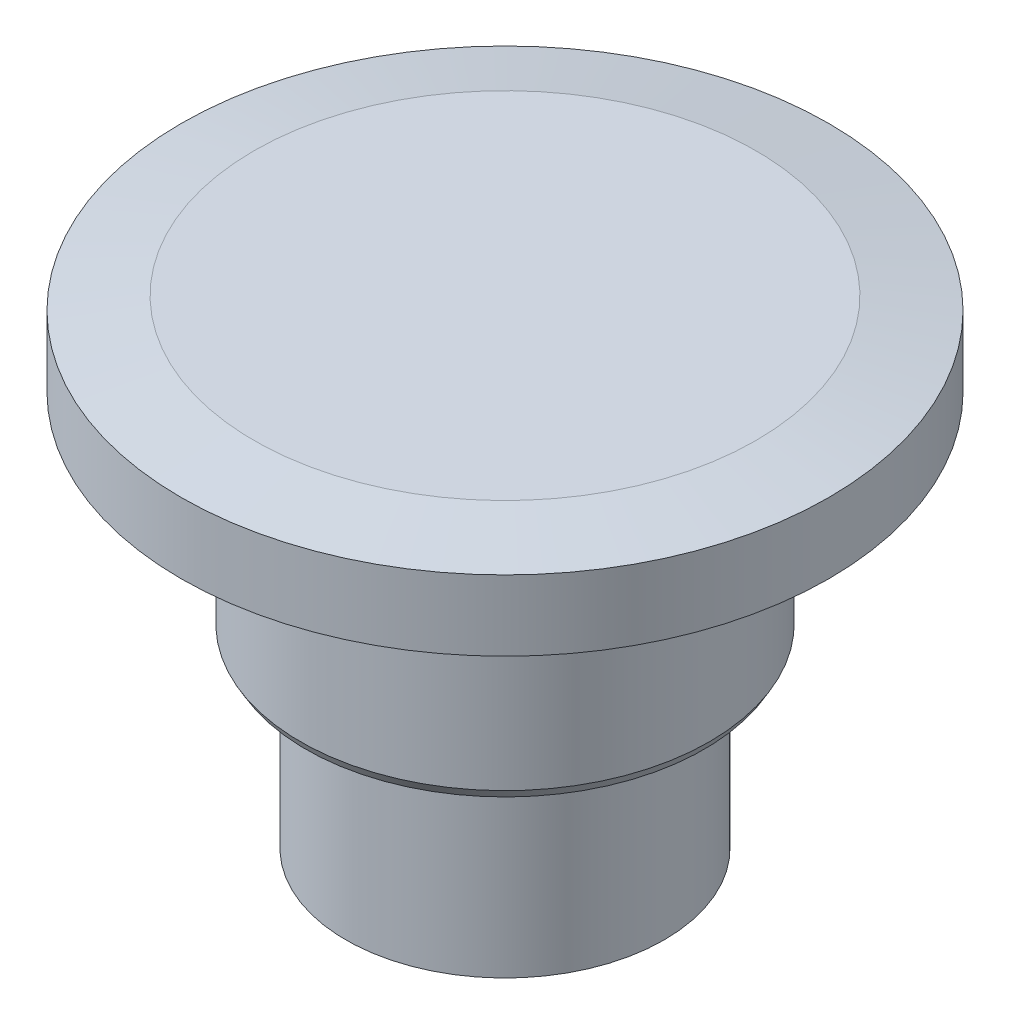
ISO-10303-21;
HEADER;
FILE_DESCRIPTION(('STEP AP214'),'2;1');
FILE_NAME('part.step','',(''),(''),'','','');
FILE_SCHEMA(('AUTOMOTIVE_DESIGN { 1 0 10303 214 1 1 1 1 }'));
ENDSEC;
DATA;
#1=APPLICATION_CONTEXT('core data for automotive mechanical design processes');
#2=APPLICATION_PROTOCOL_DEFINITION('international standard','automotive_design',2000,#1);
#3=PRODUCT_CONTEXT('',#1,'mechanical');
#4=PRODUCT('Part','Part','',(#3));
#5=PRODUCT_RELATED_PRODUCT_CATEGORY('part','',(#4));
#6=PRODUCT_DEFINITION_FORMATION('','',#4);
#7=PRODUCT_DEFINITION_CONTEXT('part definition',#1,'design');
#8=PRODUCT_DEFINITION('design','',#6,#7);
#9=PRODUCT_DEFINITION_SHAPE('','',#8);
#10=(LENGTH_UNIT() NAMED_UNIT(*) SI_UNIT(.MILLI.,.METRE.));
#11=(NAMED_UNIT(*) PLANE_ANGLE_UNIT() SI_UNIT($,.RADIAN.));
#12=(NAMED_UNIT(*) SI_UNIT($,.STERADIAN.) SOLID_ANGLE_UNIT());
#13=UNCERTAINTY_MEASURE_WITH_UNIT(LENGTH_MEASURE(1.E-05),#10,'distance_accuracy_value','');
#14=(GEOMETRIC_REPRESENTATION_CONTEXT(3) GLOBAL_UNCERTAINTY_ASSIGNED_CONTEXT((#13)) GLOBAL_UNIT_ASSIGNED_CONTEXT((#10,
#11,#12)) REPRESENTATION_CONTEXT('',''));
#15=CARTESIAN_POINT('',(0.,0.,0.));
#16=DIRECTION('',(0.,0.,1.));
#17=DIRECTION('',(1.,0.,0.));
#18=AXIS2_PLACEMENT_3D('',#15,#16,#17);
#19=CARTESIAN_POINT('',(0.,-20.35,0.));
#20=DIRECTION('',(0.,-1.,0.));
#21=DIRECTION('',(1.,0.,0.));
#22=AXIS2_PLACEMENT_3D('',#19,#20,#21);
#23=PLANE('',#22);
#24=CARTESIAN_POINT('',(0.,-20.35,0.));
#25=DIRECTION('',(0.,-1.,0.));
#26=DIRECTION('',(1.,0.,0.));
#27=AXIS2_PLACEMENT_3D('',#24,#25,#26);
#28=CIRCLE('',#27,8.6);
#29=CARTESIAN_POINT('',(8.6,-20.35,0.));
#30=VERTEX_POINT('',#29);
#31=EDGE_CURVE('E244',#30,#30,#28,.T.);
#32=ORIENTED_EDGE('',*,*,#31,.T.);
#33=EDGE_LOOP('',(#32));
#34=FACE_BOUND('',#33,.T.);
#35=DIRECTION('',(-0.707106781186547,0.,-0.707106781186548));
#36=VECTOR('',#35,1.);
#37=CARTESIAN_POINT('',(-4.05,-20.35,4.05));
#38=LINE('',#37,#36);
#39=CARTESIAN_POINT('',(-6.36894372506106,-20.35,1.73105627493894));
#40=VERTEX_POINT('',#39);
#41=CARTESIAN_POINT('',(-7.,-20.35,1.1));
#42=VERTEX_POINT('',#41);
#43=EDGE_CURVE('E149',#40,#42,#38,.T.);
#44=ORIENTED_EDGE('',*,*,#43,.F.);
#45=CARTESIAN_POINT('',(0.,-20.35,0.));
#46=DIRECTION('',(0.,-1.,0.));
#47=DIRECTION('',(1.,0.,0.));
#48=AXIS2_PLACEMENT_3D('',#45,#46,#47);
#49=CIRCLE('',#48,6.60000000000001);
#50=CARTESIAN_POINT('',(-6.36894372506106,-20.35,-1.73105627493894));
#51=VERTEX_POINT('',#50);
#52=EDGE_CURVE('E76',#40,#51,#49,.F.);
#53=ORIENTED_EDGE('',*,*,#52,.T.);
#54=DIRECTION('',(-0.707106781186548,0.,0.707106781186547));
#55=VECTOR('',#54,1.);
#56=CARTESIAN_POINT('',(-4.05,-20.35,-4.05));
#57=LINE('',#56,#55);
#58=CARTESIAN_POINT('',(-7.,-20.35,-1.1));
#59=VERTEX_POINT('',#58);
#60=EDGE_CURVE('E158',#51,#59,#57,.T.);
#61=ORIENTED_EDGE('',*,*,#60,.T.);
#62=DIRECTION('',(0.,0.,1.));
#63=VECTOR('',#62,1.);
#64=CARTESIAN_POINT('',(-7.,-20.35,0.));
#65=LINE('',#64,#63);
#66=EDGE_CURVE('E164',#59,#42,#65,.T.);
#67=ORIENTED_EDGE('',*,*,#66,.T.);
#68=EDGE_LOOP('',(#44,#53,#61,#67));
#69=FACE_BOUND('',#68,.T.);
#70=ADVANCED_FACE('F51',(#34,#69),#23,.T.);
#71=CARTESIAN_POINT('',(0.,-16.35,0.));
#72=DIRECTION('',(0.,1.,0.));
#73=DIRECTION('',(-1.,0.,0.));
#74=AXIS2_PLACEMENT_3D('',#71,#72,#73);
#75=PLANE('',#74);
#76=DIRECTION('',(1.,0.,0.));
#77=VECTOR('',#76,1.);
#78=CARTESIAN_POINT('',(0.,-16.35,-1.85));
#79=LINE('',#78,#77);
#80=CARTESIAN_POINT('',(-2.36167313572391,-16.35,-1.85));
#81=VERTEX_POINT('',#80);
#82=CARTESIAN_POINT('',(-0.75,-16.35,-1.85));
#83=VERTEX_POINT('',#82);
#84=EDGE_CURVE('E241',#81,#83,#79,.T.);
#85=ORIENTED_EDGE('',*,*,#84,.F.);
#86=CARTESIAN_POINT('',(0.,-16.35,0.));
#87=DIRECTION('',(0.,-1.,0.));
#88=DIRECTION('',(1.,0.,0.));
#89=AXIS2_PLACEMENT_3D('',#86,#87,#88);
#90=CIRCLE('',#89,3.);
#91=CARTESIAN_POINT('',(-2.36167313572391,-16.35,1.85));
#92=VERTEX_POINT('',#91);
#93=EDGE_CURVE('E270',#81,#92,#90,.T.);
#94=ORIENTED_EDGE('',*,*,#93,.T.);
#95=DIRECTION('',(1.,0.,0.));
#96=VECTOR('',#95,1.);
#97=CARTESIAN_POINT('',(0.,-16.35,1.85));
#98=LINE('',#97,#96);
#99=CARTESIAN_POINT('',(-0.75,-16.35,1.85));
#100=VERTEX_POINT('',#99);
#101=EDGE_CURVE('E234',#92,#100,#98,.T.);
#102=ORIENTED_EDGE('',*,*,#101,.T.);
#103=DIRECTION('',(0.707106781186548,0.,-0.707106781186547));
#104=VECTOR('',#103,1.);
#105=CARTESIAN_POINT('',(0.550000000000001,-16.35,0.550000000000001));
#106=LINE('',#105,#104);
#107=CARTESIAN_POINT('',(0.,-16.35,1.1));
#108=VERTEX_POINT('',#107);
#109=EDGE_CURVE('E294',#100,#108,#106,.T.);
#110=ORIENTED_EDGE('',*,*,#109,.T.);
#111=DIRECTION('',(0.,0.,-1.));
#112=VECTOR('',#111,1.);
#113=CARTESIAN_POINT('',(0.,-16.35,0.));
#114=LINE('',#113,#112);
#115=CARTESIAN_POINT('',(0.,-16.35,-1.1));
#116=VERTEX_POINT('',#115);
#117=EDGE_CURVE('E298',#108,#116,#114,.T.);
#118=ORIENTED_EDGE('',*,*,#117,.T.);
#119=DIRECTION('',(0.707106781186548,0.,0.707106781186548));
#120=VECTOR('',#119,1.);
#121=CARTESIAN_POINT('',(0.549999999999999,-16.35,-0.549999999999999));
#122=LINE('',#121,#120);
#123=EDGE_CURVE('E302',#83,#116,#122,.T.);
#124=ORIENTED_EDGE('',*,*,#123,.F.);
#125=EDGE_LOOP('',(#85,#94,#102,#110,#118,#124));
#126=FACE_BOUND('',#125,.T.);
#127=ADVANCED_FACE('F348',(#126),#75,.F.);
#128=CARTESIAN_POINT('',(0.,-16.35,0.));
#129=DIRECTION('',(0.,-1.,0.));
#130=DIRECTION('',(1.,0.,0.));
#131=AXIS2_PLACEMENT_3D('',#128,#129,#130);
#132=CYLINDRICAL_SURFACE('',#131,3.);
#133=DIRECTION('',(0.,-1.,0.));
#134=VECTOR('',#133,1.);
#135=CARTESIAN_POINT('',(-2.36167313572391,-16.35,-1.85));
#136=LINE('',#135,#134);
#137=CARTESIAN_POINT('',(-2.36167313572391,-10.1,-1.85));
#138=VERTEX_POINT('',#137);
#139=EDGE_CURVE('E238',#138,#81,#136,.T.);
#140=ORIENTED_EDGE('',*,*,#139,.F.);
#141=CARTESIAN_POINT('',(0.,-10.1,0.));
#142=DIRECTION('',(0.,-1.,0.));
#143=DIRECTION('',(1.,0.,0.));
#144=AXIS2_PLACEMENT_3D('',#141,#142,#143);
#145=CIRCLE('',#144,3.);
#146=CARTESIAN_POINT('',(-2.36167313572391,-10.1,1.85));
#147=VERTEX_POINT('',#146);
#148=EDGE_CURVE('E274',#138,#147,#145,.T.);
#149=ORIENTED_EDGE('',*,*,#148,.T.);
#150=DIRECTION('',(0.,-1.,0.));
#151=VECTOR('',#150,1.);
#152=CARTESIAN_POINT('',(-2.36167313572391,-16.35,1.85));
#153=LINE('',#152,#151);
#154=EDGE_CURVE('E230',#147,#92,#153,.T.);
#155=ORIENTED_EDGE('',*,*,#154,.T.);
#156=ORIENTED_EDGE('',*,*,#93,.F.);
#157=EDGE_LOOP('',(#140,#149,#155,#156));
#158=FACE_BOUND('',#157,.T.);
#159=ADVANCED_FACE('F383',(#158),#132,.T.);
#160=CARTESIAN_POINT('',(0.,-16.35,0.));
#161=DIRECTION('',(0.,-1.,0.));
#162=DIRECTION('',(1.,0.,0.));
#163=AXIS2_PLACEMENT_3D('',#160,#161,#162);
#164=CYLINDRICAL_SURFACE('',#163,5.6);
#165=DIRECTION('',(0.,-1.,0.));
#166=VECTOR('',#165,1.);
#167=CARTESIAN_POINT('',(-5.28559362796649,-16.35,-1.85));
#168=LINE('',#167,#166);
#169=CARTESIAN_POINT('',(-5.28559362796649,-19.35,-1.85));
#170=VERTEX_POINT('',#169);
#171=CARTESIAN_POINT('',(-5.28559362796649,-10.1,-1.85));
#172=VERTEX_POINT('',#171);
#173=EDGE_CURVE('E291',#170,#172,#168,.F.);
#174=ORIENTED_EDGE('',*,*,#173,.F.);
#175=CARTESIAN_POINT('',(0.,-19.35,0.));
#176=DIRECTION('',(0.,-1.,0.));
#177=DIRECTION('',(1.,0.,0.));
#178=AXIS2_PLACEMENT_3D('',#175,#176,#177);
#179=CIRCLE('',#178,5.6);
#180=CARTESIAN_POINT('',(-5.28559362796649,-19.35,1.85));
#181=VERTEX_POINT('',#180);
#182=EDGE_CURVE('E305',#170,#181,#179,.T.);
#183=ORIENTED_EDGE('',*,*,#182,.T.);
#184=DIRECTION('',(0.,-1.,0.));
#185=VECTOR('',#184,1.);
#186=CARTESIAN_POINT('',(-5.28559362796649,-16.35,1.85));
#187=LINE('',#186,#185);
#188=CARTESIAN_POINT('',(-5.28559362796649,-10.1,1.85));
#189=VERTEX_POINT('',#188);
#190=EDGE_CURVE('E253',#181,#189,#187,.F.);
#191=ORIENTED_EDGE('',*,*,#190,.T.);
#192=CARTESIAN_POINT('',(0.,-10.1,0.));
#193=DIRECTION('',(0.,-1.,0.));
#194=DIRECTION('',(1.,0.,0.));
#195=AXIS2_PLACEMENT_3D('',#192,#193,#194);
#196=CIRCLE('',#195,5.6);
#197=EDGE_CURVE('E278',#172,#189,#196,.T.);
#198=ORIENTED_EDGE('',*,*,#197,.F.);
#199=EDGE_LOOP('',(#174,#183,#191,#198));
#200=FACE_BOUND('',#199,.T.);
#201=ADVANCED_FACE('F387',(#200),#164,.F.);
#202=CARTESIAN_POINT('',(0.,-10.35,0.));
#203=DIRECTION('',(0.,1.,0.));
#204=DIRECTION('',(-1.,0.,0.));
#205=AXIS2_PLACEMENT_3D('',#202,#203,#204);
#206=PLANE('',#205);
#207=CARTESIAN_POINT('',(0.,-10.35,0.));
#208=DIRECTION('',(0.,1.,0.));
#209=DIRECTION('',(-1.,0.,0.));
#210=AXIS2_PLACEMENT_3D('',#207,#208,#209);
#211=CIRCLE('',#210,10.7613248654052);
#212=CARTESIAN_POINT('',(-10.7613248654052,-10.35,0.));
#213=VERTEX_POINT('',#212);
#214=EDGE_CURVE('E61',#213,#213,#211,.F.);
#215=ORIENTED_EDGE('',*,*,#214,.T.);
#216=EDGE_LOOP('',(#215));
#217=FACE_BOUND('',#216,.T.);
#218=CARTESIAN_POINT('',(0.,-10.35,0.));
#219=DIRECTION('',(0.,-1.,0.));
#220=DIRECTION('',(1.,0.,0.));
#221=AXIS2_PLACEMENT_3D('',#218,#219,#220);
#222=CIRCLE('',#221,8.6);
#223=CARTESIAN_POINT('',(8.6,-10.35,0.));
#224=VERTEX_POINT('',#223);
#225=EDGE_CURVE('E249',#224,#224,#222,.T.);
#226=ORIENTED_EDGE('',*,*,#225,.F.);
#227=EDGE_LOOP('',(#226));
#228=FACE_BOUND('',#227,.T.);
#229=ADVANCED_FACE('F379',(#217,#228),#206,.F.);
#230=CARTESIAN_POINT('',(0.,5.5,0.));
#231=DIRECTION('',(0.,-1.,0.));
#232=DIRECTION('',(1.,0.,0.));
#233=AXIS2_PLACEMENT_3D('',#230,#231,#232);
#234=PLANE('',#233);
#235=CARTESIAN_POINT('',(0.,5.5,0.));
#236=DIRECTION('',(0.,-1.,0.));
#237=DIRECTION('',(1.,0.,0.));
#238=AXIS2_PLACEMENT_3D('',#235,#236,#237);
#239=CIRCLE('',#238,13.5607689879512);
#240=CARTESIAN_POINT('',(13.5607689879512,5.5,0.));
#241=VERTEX_POINT('',#240);
#242=EDGE_CURVE('E266',#241,#241,#239,.T.);
#243=ORIENTED_EDGE('',*,*,#242,.F.);
#244=EDGE_LOOP('',(#243));
#245=FACE_BOUND('',#244,.T.);
#246=ADVANCED_FACE('F375',(#245),#234,.F.);
#247=CARTESIAN_POINT('',(0.,4.8054072893323,0.));
#248=DIRECTION('',(0.,-1.,0.));
#249=DIRECTION('',(1.,0.,0.));
#250=AXIS2_PLACEMENT_3D('',#247,#248,#249);
#251=CONICAL_SURFACE('',#250,17.5,1.39626340159547);
#252=ORIENTED_EDGE('',*,*,#242,.T.);
#253=EDGE_LOOP('',(#252));
#254=FACE_BOUND('',#253,.T.);
#255=CARTESIAN_POINT('',(0.,4.8054072893323,0.));
#256=DIRECTION('',(0.,-1.,0.));
#257=DIRECTION('',(1.,0.,0.));
#258=AXIS2_PLACEMENT_3D('',#255,#256,#257);
#259=CIRCLE('',#258,17.5);
#260=CARTESIAN_POINT('',(17.5,4.8054072893323,0.));
#261=VERTEX_POINT('',#260);
#262=EDGE_CURVE('E262',#261,#261,#259,.T.);
#263=ORIENTED_EDGE('',*,*,#262,.F.);
#264=EDGE_LOOP('',(#263));
#265=FACE_BOUND('',#264,.T.);
#266=ADVANCED_FACE('F371',(#254,#265),#251,.T.);
#267=CARTESIAN_POINT('',(0.,-16.35,0.));
#268=DIRECTION('',(0.,-1.,0.));
#269=DIRECTION('',(1.,0.,0.));
#270=AXIS2_PLACEMENT_3D('',#267,#268,#269);
#271=CYLINDRICAL_SURFACE('',#270,17.5);
#272=CARTESIAN_POINT('',(0.,1.00000000000006,0.));
#273=DIRECTION('',(0.,-1.,0.));
#274=DIRECTION('',(1.,0.,0.));
#275=AXIS2_PLACEMENT_3D('',#272,#273,#274);
#276=CIRCLE('',#275,17.5);
#277=CARTESIAN_POINT('',(17.5,1.00000000000006,0.));
#278=VERTEX_POINT('',#277);
#279=EDGE_CURVE('E282',#278,#278,#276,.F.);
#280=ORIENTED_EDGE('',*,*,#279,.T.);
#281=EDGE_LOOP('',(#280));
#282=FACE_BOUND('',#281,.T.);
#283=ORIENTED_EDGE('',*,*,#262,.T.);
#284=EDGE_LOOP('',(#283));
#285=FACE_BOUND('',#284,.T.);
#286=ADVANCED_FACE('F367',(#282,#285),#271,.T.);
#287=CARTESIAN_POINT('',(0.,-16.35,0.));
#288=DIRECTION('',(0.,-1.,0.));
#289=DIRECTION('',(1.,0.,0.));
#290=AXIS2_PLACEMENT_3D('',#287,#288,#289);
#291=CYLINDRICAL_SURFACE('',#290,12.05);
#292=CARTESIAN_POINT('',(0.,0.330824143079245,0.));
#293=DIRECTION('',(0.,1.,0.));
#294=DIRECTION('',(-1.,0.,0.));
#295=AXIS2_PLACEMENT_3D('',#292,#293,#294);
#296=CIRCLE('',#295,12.05);
#297=CARTESIAN_POINT('',(-12.05,0.330824143079245,0.));
#298=VERTEX_POINT('',#297);
#299=EDGE_CURVE('E254',#298,#298,#296,.F.);
#300=ORIENTED_EDGE('',*,*,#299,.T.);
#301=EDGE_LOOP('',(#300));
#302=FACE_BOUND('',#301,.T.);
#303=CARTESIAN_POINT('',(0.,-0.350000000000003,0.));
#304=DIRECTION('',(0.,-1.,0.));
#305=DIRECTION('',(1.,0.,0.));
#306=AXIS2_PLACEMENT_3D('',#303,#304,#305);
#307=CIRCLE('',#306,12.05);
#308=CARTESIAN_POINT('',(12.05,-0.350000000000003,0.));
#309=VERTEX_POINT('',#308);
#310=EDGE_CURVE('E258',#309,#309,#307,.T.);
#311=ORIENTED_EDGE('',*,*,#310,.F.);
#312=EDGE_LOOP('',(#311));
#313=FACE_BOUND('',#312,.T.);
#314=ADVANCED_FACE('F363',(#302,#313),#291,.T.);
#315=CARTESIAN_POINT('',(0.,-0.350000000000001,0.));
#316=DIRECTION('',(0.,1.,0.));
#317=DIRECTION('',(-1.,0.,0.));
#318=AXIS2_PLACEMENT_3D('',#315,#316,#317);
#319=PLANE('',#318);
#320=CARTESIAN_POINT('',(0.,-0.35,0.));
#321=DIRECTION('',(0.,-1.,0.));
#322=DIRECTION('',(1.,0.,0.));
#323=AXIS2_PLACEMENT_3D('',#320,#321,#322);
#324=CIRCLE('',#323,11.05);
#325=CARTESIAN_POINT('',(11.05,-0.35,0.));
#326=VERTEX_POINT('',#325);
#327=EDGE_CURVE('E248',#326,#326,#324,.T.);
#328=ORIENTED_EDGE('',*,*,#327,.F.);
#329=EDGE_LOOP('',(#328));
#330=FACE_BOUND('',#329,.T.);
#331=ORIENTED_EDGE('',*,*,#310,.T.);
#332=EDGE_LOOP('',(#331));
#333=FACE_BOUND('',#332,.T.);
#334=ADVANCED_FACE('F359',(#330,#333),#319,.F.);
#335=CARTESIAN_POINT('',(0.,-16.35,0.));
#336=DIRECTION('',(0.,-1.,0.));
#337=DIRECTION('',(1.,0.,0.));
#338=AXIS2_PLACEMENT_3D('',#335,#336,#337);
#339=CYLINDRICAL_SURFACE('',#338,11.05);
#340=CARTESIAN_POINT('',(0.,-9.85,0.));
#341=DIRECTION('',(0.,1.,0.));
#342=DIRECTION('',(-1.,0.,0.));
#343=AXIS2_PLACEMENT_3D('',#340,#341,#342);
#344=CIRCLE('',#343,11.05);
#345=CARTESIAN_POINT('',(-11.05,-9.85,0.));
#346=VERTEX_POINT('',#345);
#347=EDGE_CURVE('E11',#346,#346,#344,.T.);
#348=ORIENTED_EDGE('',*,*,#347,.T.);
#349=EDGE_LOOP('',(#348));
#350=FACE_BOUND('',#349,.T.);
#351=ORIENTED_EDGE('',*,*,#327,.T.);
#352=EDGE_LOOP('',(#351));
#353=FACE_BOUND('',#352,.T.);
#354=ADVANCED_FACE('F356',(#350,#353),#339,.T.);
#355=CARTESIAN_POINT('',(0.,0.,0.));
#356=DIRECTION('',(0.,1.,0.));
#357=DIRECTION('',(-1.,0.,0.));
#358=AXIS2_PLACEMENT_3D('',#355,#356,#357);
#359=CONICAL_SURFACE('',#358,9.35565357202472,1.4486232791553);
#360=ORIENTED_EDGE('',*,*,#279,.F.);
#361=EDGE_LOOP('',(#360));
#362=FACE_BOUND('',#361,.T.);
#363=ORIENTED_EDGE('',*,*,#299,.F.);
#364=EDGE_LOOP('',(#363));
#365=FACE_BOUND('',#364,.T.);
#366=ADVANCED_FACE('F354',(#362,#365),#359,.T.);
#367=CARTESIAN_POINT('',(0.,-20.35,0.));
#368=DIRECTION('',(0.,1.,0.));
#369=DIRECTION('',(-1.,0.,0.));
#370=AXIS2_PLACEMENT_3D('',#367,#368,#369);
#371=CYLINDRICAL_SURFACE('',#370,8.6);
#372=ORIENTED_EDGE('',*,*,#31,.F.);
#373=EDGE_LOOP('',(#372));
#374=FACE_BOUND('',#373,.T.);
#375=ORIENTED_EDGE('',*,*,#225,.T.);
#376=EDGE_LOOP('',(#375));
#377=FACE_BOUND('',#376,.T.);
#378=ADVANCED_FACE('F350',(#374,#377),#371,.T.);
#379=CARTESIAN_POINT('',(0.,-10.1,0.));
#380=DIRECTION('',(0.,-1.,0.));
#381=DIRECTION('',(1.,0.,0.));
#382=AXIS2_PLACEMENT_3D('',#379,#380,#381);
#383=PLANE('',#382);
#384=DIRECTION('',(1.,0.,0.));
#385=VECTOR('',#384,1.);
#386=CARTESIAN_POINT('',(0.,-10.1,-1.85));
#387=LINE('',#386,#385);
#388=CARTESIAN_POINT('',(-6.25,-10.1,-1.85));
#389=VERTEX_POINT('',#388);
#390=EDGE_CURVE('E198',#389,#172,#387,.T.);
#391=ORIENTED_EDGE('',*,*,#390,.T.);
#392=ORIENTED_EDGE('',*,*,#197,.T.);
#393=DIRECTION('',(1.,0.,0.));
#394=VECTOR('',#393,1.);
#395=CARTESIAN_POINT('',(0.,-10.1,1.85));
#396=LINE('',#395,#394);
#397=CARTESIAN_POINT('',(-6.25,-10.1,1.85));
#398=VERTEX_POINT('',#397);
#399=EDGE_CURVE('E183',#398,#189,#396,.T.);
#400=ORIENTED_EDGE('',*,*,#399,.F.);
#401=DIRECTION('',(0.707106781186547,0.,0.707106781186548));
#402=VECTOR('',#401,1.);
#403=CARTESIAN_POINT('',(-4.05,-10.1,4.05));
#404=LINE('',#403,#402);
#405=CARTESIAN_POINT('',(-7.,-10.1,1.1));
#406=VERTEX_POINT('',#405);
#407=EDGE_CURVE('E187',#406,#398,#404,.T.);
#408=ORIENTED_EDGE('',*,*,#407,.F.);
#409=DIRECTION('',(0.,0.,-1.));
#410=VECTOR('',#409,1.);
#411=CARTESIAN_POINT('',(-7.,-10.1,0.));
#412=LINE('',#411,#410);
#413=CARTESIAN_POINT('',(-7.,-10.1,-1.1));
#414=VERTEX_POINT('',#413);
#415=EDGE_CURVE('E166',#406,#414,#412,.T.);
#416=ORIENTED_EDGE('',*,*,#415,.T.);
#417=DIRECTION('',(0.707106781186548,0.,-0.707106781186547));
#418=VECTOR('',#417,1.);
#419=CARTESIAN_POINT('',(-4.05,-10.1,-4.05));
#420=LINE('',#419,#418);
#421=EDGE_CURVE('E193',#414,#389,#420,.T.);
#422=ORIENTED_EDGE('',*,*,#421,.T.);
#423=EDGE_LOOP('',(#391,#392,#400,#408,#416,#422));
#424=FACE_BOUND('',#423,.T.);
#425=ORIENTED_EDGE('',*,*,#148,.F.);
#426=CARTESIAN_POINT('',(-0.75,-10.1,-1.85));
#427=VERTEX_POINT('',#426);
#428=EDGE_CURVE('E197',#138,#427,#387,.T.);
#429=ORIENTED_EDGE('',*,*,#428,.T.);
#430=DIRECTION('',(0.707106781186548,0.,0.707106781186548));
#431=VECTOR('',#430,1.);
#432=CARTESIAN_POINT('',(0.549999999999999,-10.1,-0.549999999999999));
#433=LINE('',#432,#431);
#434=CARTESIAN_POINT('',(0.,-10.1,-1.1));
#435=VERTEX_POINT('',#434);
#436=EDGE_CURVE('E202',#427,#435,#433,.T.);
#437=ORIENTED_EDGE('',*,*,#436,.T.);
#438=DIRECTION('',(0.,0.,-1.));
#439=VECTOR('',#438,1.);
#440=CARTESIAN_POINT('',(0.,-10.1,0.));
#441=LINE('',#440,#439);
#442=CARTESIAN_POINT('',(0.,-10.1,1.1));
#443=VERTEX_POINT('',#442);
#444=EDGE_CURVE('E206',#443,#435,#441,.T.);
#445=ORIENTED_EDGE('',*,*,#444,.F.);
#446=DIRECTION('',(0.707106781186548,0.,-0.707106781186547));
#447=VECTOR('',#446,1.);
#448=CARTESIAN_POINT('',(0.550000000000001,-10.1,0.550000000000001));
#449=LINE('',#448,#447);
#450=CARTESIAN_POINT('',(-0.75,-10.1,1.85));
#451=VERTEX_POINT('',#450);
#452=EDGE_CURVE('E209',#451,#443,#449,.T.);
#453=ORIENTED_EDGE('',*,*,#452,.F.);
#454=EDGE_CURVE('E188',#147,#451,#396,.T.);
#455=ORIENTED_EDGE('',*,*,#454,.F.);
#456=EDGE_LOOP('',(#425,#429,#437,#445,#453,#455));
#457=FACE_BOUND('',#456,.T.);
#458=ADVANCED_FACE('F353',(#424,#457),#383,.T.);
#459=CARTESIAN_POINT('',(0.,-2.18229831327297,1.85));
#460=DIRECTION('',(0.,0.,1.));
#461=DIRECTION('',(1.,0.,0.));
#462=AXIS2_PLACEMENT_3D('',#459,#460,#461);
#463=PLANE('',#462);
#464=ORIENTED_EDGE('',*,*,#190,.F.);
#465=CARTESIAN_POINT('',(-5.28559362796649,-19.35,1.85));
#466=CARTESIAN_POINT('',(-5.36628547886081,-19.426162676069,1.85));
#467=CARTESIAN_POINT('',(-5.44688346656384,-19.5024246945908,1.85));
#468=CARTESIAN_POINT('',(-5.60791103759497,-19.6551257140025,1.85));
#469=CARTESIAN_POINT('',(-5.68834062156971,-19.7315647142103,1.85));
#470=CARTESIAN_POINT('',(-5.84905126260502,-19.8845985188028,1.85));
#471=CARTESIAN_POINT('',(-5.92933231978582,-19.9611933230613,1.85));
#472=CARTESIAN_POINT('',(-6.08976181675327,-20.1145223171229,1.85));
#473=CARTESIAN_POINT('',(-6.16991025602906,-20.1912565074607,1.85));
#474=CARTESIAN_POINT('',(-6.25,-20.2680518561914,1.85));
#475=B_SPLINE_CURVE_WITH_KNOTS('',3,(#465,#466,#467,#468,#469,#470,#471,#472,#473,#474),
.UNSPECIFIED.,.F.,.F.,(4,2,2,2,4),(0.,0.332877197810181,0.665753115085357,0.99862876281833,
1.33150568990947),.UNSPECIFIED.);
#476=CARTESIAN_POINT('',(-6.25,-20.2680518561914,1.85));
#477=VERTEX_POINT('',#476);
#478=EDGE_CURVE('E309',#181,#477,#475,.T.);
#479=ORIENTED_EDGE('',*,*,#478,.T.);
#480=DIRECTION('',(0.,-1.,0.));
#481=VECTOR('',#480,1.);
#482=CARTESIAN_POINT('',(-6.25,-2.18229831327297,1.85));
#483=LINE('',#482,#481);
#484=EDGE_CURVE('E170',#398,#477,#483,.T.);
#485=ORIENTED_EDGE('',*,*,#484,.F.);
#486=ORIENTED_EDGE('',*,*,#399,.T.);
#487=EDGE_LOOP('',(#464,#479,#485,#486));
#488=FACE_BOUND('',#487,.T.);
#489=ADVANCED_FACE('F333',(#488),#463,.F.);
#490=CARTESIAN_POINT('',(0.,-2.18229831327297,-1.85));
#491=DIRECTION('',(0.,0.,1.));
#492=DIRECTION('',(1.,0.,0.));
#493=AXIS2_PLACEMENT_3D('',#490,#491,#492);
#494=PLANE('',#493);
#495=DIRECTION('',(0.,-1.,0.));
#496=VECTOR('',#495,1.);
#497=CARTESIAN_POINT('',(-6.25,-2.18229831327297,-1.85));
#498=LINE('',#497,#496);
#499=CARTESIAN_POINT('',(-6.25,-20.2680518561914,-1.85));
#500=VERTEX_POINT('',#499);
#501=EDGE_CURVE('E218',#389,#500,#498,.T.);
#502=ORIENTED_EDGE('',*,*,#501,.T.);
#503=CARTESIAN_POINT('',(-6.25,-20.2680518561914,-1.85));
#504=CARTESIAN_POINT('',(-6.16991025602906,-20.1912565074607,-1.85));
#505=CARTESIAN_POINT('',(-6.08976181675327,-20.1145223171229,-1.85));
#506=CARTESIAN_POINT('',(-5.92933231978582,-19.9611933230613,-1.85));
#507=CARTESIAN_POINT('',(-5.84905126260502,-19.8845985188028,-1.85));
#508=CARTESIAN_POINT('',(-5.68834062156971,-19.7315647142103,-1.85));
#509=CARTESIAN_POINT('',(-5.60791103759497,-19.6551257140025,-1.85));
#510=CARTESIAN_POINT('',(-5.44688346656384,-19.5024246945908,-1.85));
#511=CARTESIAN_POINT('',(-5.36628547886081,-19.426162676069,-1.85));
#512=CARTESIAN_POINT('',(-5.28559362796649,-19.35,-1.85));
#513=B_SPLINE_CURVE_WITH_KNOTS('',3,(#503,#504,#505,#506,#507,#508,#509,#510,#511,#512),
.UNSPECIFIED.,.F.,.F.,(4,2,2,2,4),(0.,0.332876927091138,0.665752574824111,0.998628492099287,
1.33150568990947),.UNSPECIFIED.);
#514=EDGE_CURVE('E552',#500,#170,#513,.T.);
#515=ORIENTED_EDGE('',*,*,#514,.T.);
#516=ORIENTED_EDGE('',*,*,#173,.T.);
#517=ORIENTED_EDGE('',*,*,#390,.F.);
#518=EDGE_LOOP('',(#502,#515,#516,#517));
#519=FACE_BOUND('',#518,.T.);
#520=ADVANCED_FACE('F473',(#519),#494,.T.);
#521=CARTESIAN_POINT('',(-4.05,-2.18229831327297,4.05));
#522=DIRECTION('',(-0.707106781186548,0.,0.707106781186547));
#523=DIRECTION('',(0.707106781186547,0.,0.707106781186548));
#524=AXIS2_PLACEMENT_3D('',#521,#522,#523);
#525=PLANE('',#524);
#526=ORIENTED_EDGE('',*,*,#484,.T.);
#527=CARTESIAN_POINT('',(-6.25,-20.2680518561914,1.85));
#528=CARTESIAN_POINT('',(-6.2699002890006,-20.2814882945763,1.8300997109994));
#529=CARTESIAN_POINT('',(-6.28976241155268,-20.2950355264299,1.81023758844731));
#530=CARTESIAN_POINT('',(-6.32941031989148,-20.3223515744093,1.77058968010852));
#531=CARTESIAN_POINT('',(-6.34919610569307,-20.3361203904919,1.75080389430693));
#532=CARTESIAN_POINT('',(-6.36894372506106,-20.35,1.73105627493894));
#533=B_SPLINE_CURVE_WITH_KNOTS('',3,(#527,#528,#529,#530,#531,#532),.UNSPECIFIED.,.F.,.F.,(4,2,
4),(0.,0.0935564954398946,0.187112972623506),.UNSPECIFIED.);
#534=EDGE_CURVE('E155',#477,#40,#533,.T.);
#535=ORIENTED_EDGE('',*,*,#534,.T.);
#536=ORIENTED_EDGE('',*,*,#43,.T.);
#537=DIRECTION('',(0.,-1.,0.));
#538=VECTOR('',#537,1.);
#539=CARTESIAN_POINT('',(-7.,-2.18229831327297,1.1));
#540=LINE('',#539,#538);
#541=EDGE_CURVE('E153',#406,#42,#540,.T.);
#542=ORIENTED_EDGE('',*,*,#541,.F.);
#543=ORIENTED_EDGE('',*,*,#407,.T.);
#544=EDGE_LOOP('',(#526,#535,#536,#542,#543));
#545=FACE_BOUND('',#544,.T.);
#546=ADVANCED_FACE('F152',(#545),#525,.F.);
#547=CARTESIAN_POINT('',(-7.,-2.18229831327297,0.));
#548=DIRECTION('',(1.,0.,0.));
#549=DIRECTION('',(0.,1.,0.));
#550=AXIS2_PLACEMENT_3D('',#547,#548,#549);
#551=PLANE('',#550);
#552=ORIENTED_EDGE('',*,*,#541,.T.);
#553=ORIENTED_EDGE('',*,*,#66,.F.);
#554=DIRECTION('',(0.,-1.,0.));
#555=VECTOR('',#554,1.);
#556=CARTESIAN_POINT('',(-7.,-2.18229831327297,-1.1));
#557=LINE('',#556,#555);
#558=EDGE_CURVE('E169',#414,#59,#557,.T.);
#559=ORIENTED_EDGE('',*,*,#558,.F.);
#560=ORIENTED_EDGE('',*,*,#415,.F.);
#561=EDGE_LOOP('',(#552,#553,#559,#560));
#562=FACE_BOUND('',#561,.T.);
#563=ADVANCED_FACE('F162',(#562),#551,.T.);
#564=CARTESIAN_POINT('',(-4.05,-2.18229831327297,-4.05));
#565=DIRECTION('',(0.707106781186547,0.,0.707106781186548));
#566=DIRECTION('',(0.707106781186548,0.,-0.707106781186547));
#567=AXIS2_PLACEMENT_3D('',#564,#565,#566);
#568=PLANE('',#567);
#569=ORIENTED_EDGE('',*,*,#60,.F.);
#570=CARTESIAN_POINT('',(-6.36894372506106,-20.35,-1.73105627493894));
#571=CARTESIAN_POINT('',(-6.34919610569307,-20.3361203904919,-1.75080389430693));
#572=CARTESIAN_POINT('',(-6.32941031989148,-20.3223515744093,-1.77058968010852));
#573=CARTESIAN_POINT('',(-6.28976241155268,-20.2950355264299,-1.81023758844731));
#574=CARTESIAN_POINT('',(-6.2699002890006,-20.2814882945763,-1.8300997109994));
#575=CARTESIAN_POINT('',(-6.25,-20.2680518561914,-1.85));
#576=B_SPLINE_CURVE_WITH_KNOTS('',3,(#570,#571,#572,#573,#574,#575),.UNSPECIFIED.,.F.,.F.,(4,2,
4),(0.,0.0935564771836118,0.187112972623504),.UNSPECIFIED.);
#577=EDGE_CURVE('E68',#51,#500,#576,.T.);
#578=ORIENTED_EDGE('',*,*,#577,.T.);
#579=ORIENTED_EDGE('',*,*,#501,.F.);
#580=ORIENTED_EDGE('',*,*,#421,.F.);
#581=ORIENTED_EDGE('',*,*,#558,.T.);
#582=EDGE_LOOP('',(#569,#578,#579,#580,#581));
#583=FACE_BOUND('',#582,.T.);
#584=ADVANCED_FACE('F344',(#583),#568,.T.);
#585=CARTESIAN_POINT('',(0.,-2.18229831327297,0.));
#586=DIRECTION('',(1.,0.,0.));
#587=DIRECTION('',(0.,1.,0.));
#588=AXIS2_PLACEMENT_3D('',#585,#586,#587);
#589=PLANE('',#588);
#590=DIRECTION('',(0.,-1.,0.));
#591=VECTOR('',#590,1.);
#592=CARTESIAN_POINT('',(0.,-2.18229831327297,1.1));
#593=LINE('',#592,#591);
#594=EDGE_CURVE('E174',#443,#108,#593,.T.);
#595=ORIENTED_EDGE('',*,*,#594,.F.);
#596=ORIENTED_EDGE('',*,*,#444,.T.);
#597=DIRECTION('',(0.,-1.,0.));
#598=VECTOR('',#597,1.);
#599=CARTESIAN_POINT('',(0.,-2.18229831327297,-1.1));
#600=LINE('',#599,#598);
#601=EDGE_CURVE('E210',#435,#116,#600,.T.);
#602=ORIENTED_EDGE('',*,*,#601,.T.);
#603=ORIENTED_EDGE('',*,*,#117,.F.);
#604=EDGE_LOOP('',(#595,#596,#602,#603));
#605=FACE_BOUND('',#604,.T.);
#606=ADVANCED_FACE('F341',(#605),#589,.F.);
#607=CARTESIAN_POINT('',(0.549999999999999,-2.18229831327297,-0.549999999999999));
#608=DIRECTION('',(-0.707106781186548,0.,0.707106781186548));
#609=DIRECTION('',(0.707106781186548,0.,0.707106781186548));
#610=AXIS2_PLACEMENT_3D('',#607,#608,#609);
#611=PLANE('',#610);
#612=ORIENTED_EDGE('',*,*,#123,.T.);
#613=ORIENTED_EDGE('',*,*,#601,.F.);
#614=ORIENTED_EDGE('',*,*,#436,.F.);
#615=DIRECTION('',(0.,-1.,0.));
#616=VECTOR('',#615,1.);
#617=CARTESIAN_POINT('',(-0.75,-2.18229831327297,-1.85));
#618=LINE('',#617,#616);
#619=EDGE_CURVE('E214',#427,#83,#618,.T.);
#620=ORIENTED_EDGE('',*,*,#619,.T.);
#621=EDGE_LOOP('',(#612,#613,#614,#620));
#622=FACE_BOUND('',#621,.T.);
#623=ADVANCED_FACE('F339',(#622),#611,.T.);
#624=CARTESIAN_POINT('',(0.550000000000001,-2.18229831327297,0.550000000000001));
#625=DIRECTION('',(0.707106781186547,0.,0.707106781186548));
#626=DIRECTION('',(0.707106781186548,0.,-0.707106781186547));
#627=AXIS2_PLACEMENT_3D('',#624,#625,#626);
#628=PLANE('',#627);
#629=DIRECTION('',(0.,-1.,0.));
#630=VECTOR('',#629,1.);
#631=CARTESIAN_POINT('',(-0.75,-2.18229831327297,1.85));
#632=LINE('',#631,#630);
#633=EDGE_CURVE('E179',#451,#100,#632,.T.);
#634=ORIENTED_EDGE('',*,*,#633,.F.);
#635=ORIENTED_EDGE('',*,*,#452,.T.);
#636=ORIENTED_EDGE('',*,*,#594,.T.);
#637=ORIENTED_EDGE('',*,*,#109,.F.);
#638=EDGE_LOOP('',(#634,#635,#636,#637));
#639=FACE_BOUND('',#638,.T.);
#640=ADVANCED_FACE('F336',(#639),#628,.F.);
#641=ORIENTED_EDGE('',*,*,#84,.T.);
#642=ORIENTED_EDGE('',*,*,#619,.F.);
#643=ORIENTED_EDGE('',*,*,#428,.F.);
#644=ORIENTED_EDGE('',*,*,#139,.T.);
#645=EDGE_LOOP('',(#641,#642,#643,#644));
#646=FACE_BOUND('',#645,.T.);
#647=ADVANCED_FACE('F331',(#646),#494,.T.);
#648=ORIENTED_EDGE('',*,*,#154,.F.);
#649=ORIENTED_EDGE('',*,*,#454,.T.);
#650=ORIENTED_EDGE('',*,*,#633,.T.);
#651=ORIENTED_EDGE('',*,*,#101,.F.);
#652=EDGE_LOOP('',(#648,#649,#650,#651));
#653=FACE_BOUND('',#652,.T.);
#654=ADVANCED_FACE('F327',(#653),#463,.F.);
#655=CARTESIAN_POINT('',(0.,-19.35,0.));
#656=DIRECTION('',(0.,-1.,0.));
#657=DIRECTION('',(1.,0.,0.));
#658=AXIS2_PLACEMENT_3D('',#655,#656,#657);
#659=CONICAL_SURFACE('',#658,5.6,0.785398163397449);
#660=ORIENTED_EDGE('',*,*,#577,.F.);
#661=ORIENTED_EDGE('',*,*,#52,.F.);
#662=ORIENTED_EDGE('',*,*,#534,.F.);
#663=ORIENTED_EDGE('',*,*,#478,.F.);
#664=ORIENTED_EDGE('',*,*,#182,.F.);
#665=ORIENTED_EDGE('',*,*,#514,.F.);
#666=EDGE_LOOP('',(#660,#661,#662,#663,#664,#665));
#667=FACE_BOUND('',#666,.T.);
#668=ADVANCED_FACE('F324',(#667),#659,.F.);
#669=CARTESIAN_POINT('',(0.,-10.35,0.));
#670=DIRECTION('',(0.,1.,0.));
#671=DIRECTION('',(-1.,0.,0.));
#672=AXIS2_PLACEMENT_3D('',#669,#670,#671);
#673=CONICAL_SURFACE('',#672,10.7613248654052,0.523598775598299);
#674=ORIENTED_EDGE('',*,*,#347,.F.);
#675=EDGE_LOOP('',(#674));
#676=FACE_BOUND('',#675,.T.);
#677=ORIENTED_EDGE('',*,*,#214,.F.);
#678=EDGE_LOOP('',(#677));
#679=FACE_BOUND('',#678,.T.);
#680=ADVANCED_FACE('F54',(#676,#679),#673,.T.);
#681=CLOSED_SHELL('',(#70,#127,#159,#201,#229,#246,#266,#286,#314,#334,#354,#366,#378,#458,#489,
#520,#546,#563,#584,#606,#623,#640,#647,#654,#668,#680));
#682=MANIFOLD_SOLID_BREP('B2',#681);
#683=ADVANCED_BREP_SHAPE_REPRESENTATION('',(#18,#682),#14);
#684=SHAPE_DEFINITION_REPRESENTATION(#9,#683);
ENDSEC;
END-ISO-10303-21;
